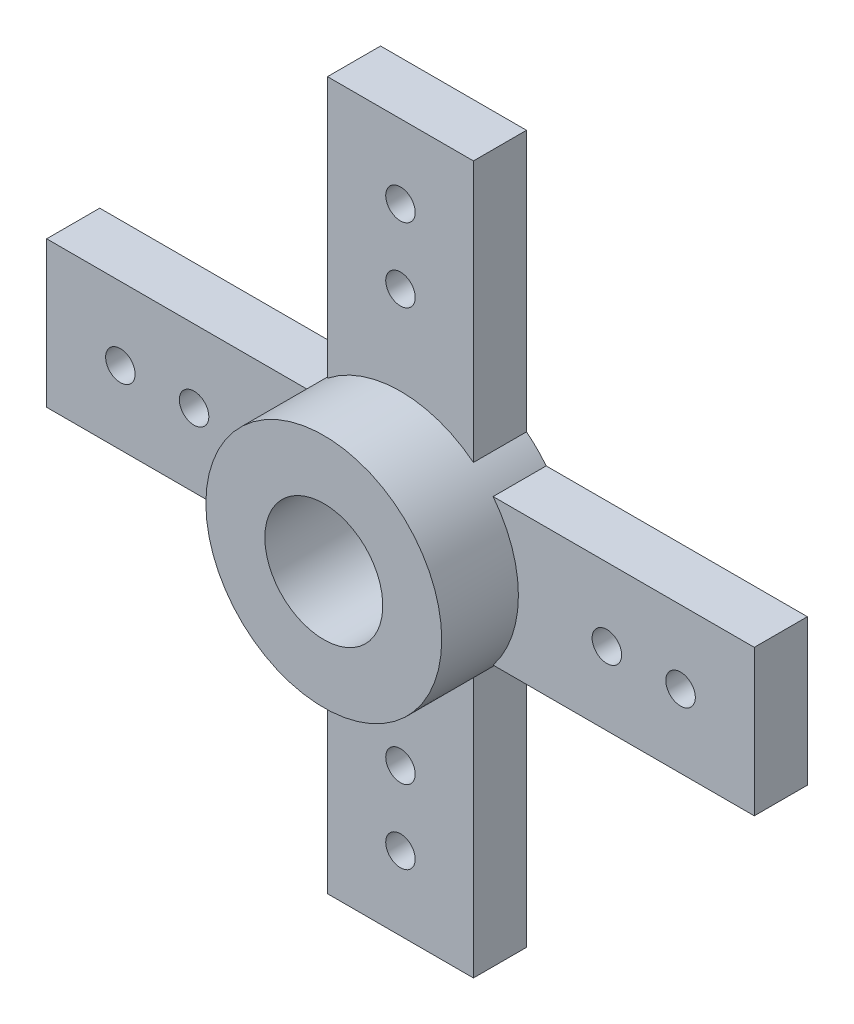
ISO-10303-21;
HEADER;
FILE_DESCRIPTION(('STEP AP214'),'2;1');
FILE_NAME('part.step','',(''),(''),'','','');
FILE_SCHEMA(('AUTOMOTIVE_DESIGN { 1 0 10303 214 1 1 1 1 }'));
ENDSEC;
DATA;
#1=APPLICATION_CONTEXT('core data for automotive mechanical design processes');
#2=APPLICATION_PROTOCOL_DEFINITION('international standard','automotive_design',2000,#1);
#3=PRODUCT_CONTEXT('',#1,'mechanical');
#4=PRODUCT('Part','Part','',(#3));
#5=PRODUCT_RELATED_PRODUCT_CATEGORY('part','',(#4));
#6=PRODUCT_DEFINITION_FORMATION('','',#4);
#7=PRODUCT_DEFINITION_CONTEXT('part definition',#1,'design');
#8=PRODUCT_DEFINITION('design','',#6,#7);
#9=PRODUCT_DEFINITION_SHAPE('','',#8);
#10=(LENGTH_UNIT() NAMED_UNIT(*) SI_UNIT(.MILLI.,.METRE.));
#11=(NAMED_UNIT(*) PLANE_ANGLE_UNIT() SI_UNIT($,.RADIAN.));
#12=(NAMED_UNIT(*) SI_UNIT($,.STERADIAN.) SOLID_ANGLE_UNIT());
#13=UNCERTAINTY_MEASURE_WITH_UNIT(LENGTH_MEASURE(1.E-05),#10,'distance_accuracy_value','');
#14=(GEOMETRIC_REPRESENTATION_CONTEXT(3) GLOBAL_UNCERTAINTY_ASSIGNED_CONTEXT((#13)) GLOBAL_UNIT_ASSIGNED_CONTEXT((#10,
#11,#12)) REPRESENTATION_CONTEXT('',''));
#15=CARTESIAN_POINT('',(0.,0.,0.));
#16=DIRECTION('',(0.,0.,1.));
#17=DIRECTION('',(1.,0.,0.));
#18=AXIS2_PLACEMENT_3D('',#15,#16,#17);
#19=CARTESIAN_POINT('',(0.,0.,1.8));
#20=DIRECTION('',(0.,0.,-1.));
#21=DIRECTION('',(-1.,0.,0.));
#22=AXIS2_PLACEMENT_3D('',#19,#20,#21);
#23=PLANE('',#22);
#24=CARTESIAN_POINT('',(0.,7.,1.8));
#25=DIRECTION('',(0.,0.,1.));
#26=DIRECTION('',(1.,0.,0.));
#27=AXIS2_PLACEMENT_3D('',#24,#25,#26);
#28=CIRCLE('',#27,0.5);
#29=CARTESIAN_POINT('',(0.499999999999999,7.,1.8));
#30=VERTEX_POINT('',#29);
#31=EDGE_CURVE('E317',#30,#30,#28,.T.);
#32=ORIENTED_EDGE('',*,*,#31,.F.);
#33=EDGE_LOOP('',(#32));
#34=FACE_BOUND('',#33,.T.);
#35=CARTESIAN_POINT('',(0.,9.5,1.8));
#36=DIRECTION('',(0.,0.,1.));
#37=DIRECTION('',(1.,0.,0.));
#38=AXIS2_PLACEMENT_3D('',#35,#36,#37);
#39=CIRCLE('',#38,0.5);
#40=CARTESIAN_POINT('',(0.5,9.5,1.8));
#41=VERTEX_POINT('',#40);
#42=EDGE_CURVE('E154',#41,#41,#39,.T.);
#43=ORIENTED_EDGE('',*,*,#42,.F.);
#44=EDGE_LOOP('',(#43));
#45=FACE_BOUND('',#44,.T.);
#46=DIRECTION('',(0.,-1.,0.));
#47=VECTOR('',#46,1.);
#48=CARTESIAN_POINT('',(-2.475,2.47499999999999,1.8));
#49=LINE('',#48,#47);
#50=CARTESIAN_POINT('',(-2.475,12.,1.8));
#51=VERTEX_POINT('',#50);
#52=CARTESIAN_POINT('',(-2.475,3.14235182626007,1.8));
#53=VERTEX_POINT('',#52);
#54=EDGE_CURVE('E120',#51,#53,#49,.T.);
#55=ORIENTED_EDGE('',*,*,#54,.T.);
#56=CARTESIAN_POINT('',(0.,0.,1.8));
#57=DIRECTION('',(0.,0.,-1.));
#58=DIRECTION('',(-1.,0.,0.));
#59=AXIS2_PLACEMENT_3D('',#56,#57,#58);
#60=CIRCLE('',#59,4.);
#61=CARTESIAN_POINT('',(2.475,3.14235182626007,1.8));
#62=VERTEX_POINT('',#61);
#63=EDGE_CURVE('E267',#53,#62,#60,.T.);
#64=ORIENTED_EDGE('',*,*,#63,.T.);
#65=DIRECTION('',(0.,1.,0.));
#66=VECTOR('',#65,1.);
#67=CARTESIAN_POINT('',(2.475,2.47500000000001,1.8));
#68=LINE('',#67,#66);
#69=CARTESIAN_POINT('',(2.475,12.,1.8));
#70=VERTEX_POINT('',#69);
#71=EDGE_CURVE('E122',#62,#70,#68,.T.);
#72=ORIENTED_EDGE('',*,*,#71,.T.);
#73=DIRECTION('',(-1.,0.,0.));
#74=VECTOR('',#73,1.);
#75=CARTESIAN_POINT('',(-2.475,12.,1.8));
#76=LINE('',#75,#74);
#77=EDGE_CURVE('E115',#70,#51,#76,.T.);
#78=ORIENTED_EDGE('',*,*,#77,.T.);
#79=EDGE_LOOP('',(#55,#64,#72,#78));
#80=FACE_BOUND('',#79,.T.);
#81=ADVANCED_FACE('F32',(#34,#45,#80),#23,.F.);
#82=CARTESIAN_POINT('',(9.49999999999999,0.,1.8));
#83=DIRECTION('',(0.,0.,1.));
#84=DIRECTION('',(-1.,0.,0.));
#85=AXIS2_PLACEMENT_3D('',#82,#83,#84);
#86=CIRCLE('',#85,0.499999999999998);
#87=CARTESIAN_POINT('',(8.99999999999999,0.,1.8));
#88=VERTEX_POINT('',#87);
#89=EDGE_CURVE('E287',#88,#88,#86,.T.);
#90=ORIENTED_EDGE('',*,*,#89,.F.);
#91=EDGE_LOOP('',(#90));
#92=FACE_BOUND('',#91,.T.);
#93=CARTESIAN_POINT('',(6.99999999999999,0.,1.8));
#94=DIRECTION('',(0.,0.,1.));
#95=DIRECTION('',(-1.,0.,0.));
#96=AXIS2_PLACEMENT_3D('',#93,#94,#95);
#97=CIRCLE('',#96,0.500000000000001);
#98=CARTESIAN_POINT('',(6.49999999999999,0.,1.8));
#99=VERTEX_POINT('',#98);
#100=EDGE_CURVE('E281',#99,#99,#97,.T.);
#101=ORIENTED_EDGE('',*,*,#100,.F.);
#102=EDGE_LOOP('',(#101));
#103=FACE_BOUND('',#102,.T.);
#104=DIRECTION('',(-1.,0.,0.));
#105=VECTOR('',#104,1.);
#106=CARTESIAN_POINT('',(2.475,2.47500000000001,1.8));
#107=LINE('',#106,#105);
#108=CARTESIAN_POINT('',(12.,2.47500000000004,1.8));
#109=VERTEX_POINT('',#108);
#110=CARTESIAN_POINT('',(3.14235182626006,2.47500000000001,1.8));
#111=VERTEX_POINT('',#110);
#112=EDGE_CURVE('E334',#109,#111,#107,.T.);
#113=ORIENTED_EDGE('',*,*,#112,.T.);
#114=CARTESIAN_POINT('',(3.14235182626008,-2.47499999999999,1.8));
#115=VERTEX_POINT('',#114);
#116=EDGE_CURVE('E260',#111,#115,#60,.T.);
#117=ORIENTED_EDGE('',*,*,#116,.T.);
#118=DIRECTION('',(1.,0.,0.));
#119=VECTOR('',#118,1.);
#120=CARTESIAN_POINT('',(2.475,-2.47499999999999,1.8));
#121=LINE('',#120,#119);
#122=CARTESIAN_POINT('',(12.,-2.47499999999996,1.8));
#123=VERTEX_POINT('',#122);
#124=EDGE_CURVE('E330',#115,#123,#121,.T.);
#125=ORIENTED_EDGE('',*,*,#124,.T.);
#126=DIRECTION('',(0.,1.,0.));
#127=VECTOR('',#126,1.);
#128=CARTESIAN_POINT('',(12.,-2.47499999999996,1.8));
#129=LINE('',#128,#127);
#130=EDGE_CURVE('E332',#123,#109,#129,.T.);
#131=ORIENTED_EDGE('',*,*,#130,.T.);
#132=EDGE_LOOP('',(#113,#117,#125,#131));
#133=FACE_BOUND('',#132,.T.);
#134=ADVANCED_FACE('F338',(#92,#103,#133),#23,.F.);
#135=CARTESIAN_POINT('',(0.,-7.,1.8));
#136=DIRECTION('',(0.,0.,1.));
#137=DIRECTION('',(-1.,0.,0.));
#138=AXIS2_PLACEMENT_3D('',#135,#136,#137);
#139=CIRCLE('',#138,0.5);
#140=CARTESIAN_POINT('',(-0.500000000000001,-7.,1.8));
#141=VERTEX_POINT('',#140);
#142=EDGE_CURVE('E305',#141,#141,#139,.T.);
#143=ORIENTED_EDGE('',*,*,#142,.F.);
#144=EDGE_LOOP('',(#143));
#145=FACE_BOUND('',#144,.T.);
#146=CARTESIAN_POINT('',(0.,-9.5,1.8));
#147=DIRECTION('',(0.,0.,1.));
#148=DIRECTION('',(-1.,0.,0.));
#149=AXIS2_PLACEMENT_3D('',#146,#147,#148);
#150=CIRCLE('',#149,0.5);
#151=CARTESIAN_POINT('',(-0.5,-9.5,1.8));
#152=VERTEX_POINT('',#151);
#153=EDGE_CURVE('E311',#152,#152,#150,.T.);
#154=ORIENTED_EDGE('',*,*,#153,.F.);
#155=EDGE_LOOP('',(#154));
#156=FACE_BOUND('',#155,.T.);
#157=DIRECTION('',(0.,1.,0.));
#158=VECTOR('',#157,1.);
#159=CARTESIAN_POINT('',(2.475,-12.,1.8));
#160=LINE('',#159,#158);
#161=CARTESIAN_POINT('',(2.475,-12.,1.8));
#162=VERTEX_POINT('',#161);
#163=CARTESIAN_POINT('',(2.475,-3.14235182626007,1.8));
#164=VERTEX_POINT('',#163);
#165=EDGE_CURVE('E258',#162,#164,#160,.T.);
#166=ORIENTED_EDGE('',*,*,#165,.T.);
#167=CARTESIAN_POINT('',(-2.475,-3.14235182626007,1.8));
#168=VERTEX_POINT('',#167);
#169=EDGE_CURVE('E252',#164,#168,#60,.T.);
#170=ORIENTED_EDGE('',*,*,#169,.T.);
#171=DIRECTION('',(0.,-1.,0.));
#172=VECTOR('',#171,1.);
#173=CARTESIAN_POINT('',(-2.475,-12.,1.8));
#174=LINE('',#173,#172);
#175=CARTESIAN_POINT('',(-2.475,-12.,1.8));
#176=VERTEX_POINT('',#175);
#177=EDGE_CURVE('E97',#168,#176,#174,.T.);
#178=ORIENTED_EDGE('',*,*,#177,.T.);
#179=DIRECTION('',(1.,0.,0.));
#180=VECTOR('',#179,1.);
#181=CARTESIAN_POINT('',(-2.475,-12.,1.8));
#182=LINE('',#181,#180);
#183=EDGE_CURVE('E194',#176,#162,#182,.T.);
#184=ORIENTED_EDGE('',*,*,#183,.T.);
#185=EDGE_LOOP('',(#166,#170,#178,#184));
#186=FACE_BOUND('',#185,.T.);
#187=ADVANCED_FACE('F257',(#145,#156,#186),#23,.F.);
#188=CARTESIAN_POINT('',(-9.5,0.,1.8));
#189=DIRECTION('',(0.,0.,1.));
#190=DIRECTION('',(1.,0.,0.));
#191=AXIS2_PLACEMENT_3D('',#188,#189,#190);
#192=CIRCLE('',#191,0.500000000000001);
#193=CARTESIAN_POINT('',(-9.,0.,1.8));
#194=VERTEX_POINT('',#193);
#195=EDGE_CURVE('E299',#194,#194,#192,.T.);
#196=ORIENTED_EDGE('',*,*,#195,.F.);
#197=EDGE_LOOP('',(#196));
#198=FACE_BOUND('',#197,.T.);
#199=DIRECTION('',(1.,0.,0.));
#200=VECTOR('',#199,1.);
#201=CARTESIAN_POINT('',(-12.,-2.47500000000004,1.8));
#202=LINE('',#201,#200);
#203=CARTESIAN_POINT('',(-12.,-2.47500000000004,1.8));
#204=VERTEX_POINT('',#203);
#205=CARTESIAN_POINT('',(-3.14235182626006,-2.47500000000001,1.8));
#206=VERTEX_POINT('',#205);
#207=EDGE_CURVE('E148',#204,#206,#202,.T.);
#208=ORIENTED_EDGE('',*,*,#207,.T.);
#209=CARTESIAN_POINT('',(-3.14235182626008,2.47499999999999,1.8));
#210=VERTEX_POINT('',#209);
#211=EDGE_CURVE('E47',#206,#210,#60,.T.);
#212=ORIENTED_EDGE('',*,*,#211,.T.);
#213=DIRECTION('',(-1.,0.,0.));
#214=VECTOR('',#213,1.);
#215=CARTESIAN_POINT('',(-12.,2.47499999999995,1.8));
#216=LINE('',#215,#214);
#217=CARTESIAN_POINT('',(-12.,2.47499999999995,1.8));
#218=VERTEX_POINT('',#217);
#219=EDGE_CURVE('E142',#210,#218,#216,.T.);
#220=ORIENTED_EDGE('',*,*,#219,.T.);
#221=DIRECTION('',(0.,-1.,0.));
#222=VECTOR('',#221,1.);
#223=CARTESIAN_POINT('',(-12.,-2.47500000000004,1.8));
#224=LINE('',#223,#222);
#225=EDGE_CURVE('E55',#218,#204,#224,.T.);
#226=ORIENTED_EDGE('',*,*,#225,.T.);
#227=EDGE_LOOP('',(#208,#212,#220,#226));
#228=FACE_BOUND('',#227,.T.);
#229=CARTESIAN_POINT('',(-7.,0.,1.8));
#230=DIRECTION('',(0.,0.,1.));
#231=DIRECTION('',(1.,0.,0.));
#232=AXIS2_PLACEMENT_3D('',#229,#230,#231);
#233=CIRCLE('',#232,0.5);
#234=CARTESIAN_POINT('',(-6.5,0.,1.8));
#235=VERTEX_POINT('',#234);
#236=EDGE_CURVE('E293',#235,#235,#233,.T.);
#237=ORIENTED_EDGE('',*,*,#236,.F.);
#238=EDGE_LOOP('',(#237));
#239=FACE_BOUND('',#238,.T.);
#240=ADVANCED_FACE('F370',(#198,#228,#239),#23,.F.);
#241=CARTESIAN_POINT('',(0.,0.,0.));
#242=DIRECTION('',(0.,0.,-1.));
#243=DIRECTION('',(-1.,0.,0.));
#244=AXIS2_PLACEMENT_3D('',#241,#242,#243);
#245=PLANE('',#244);
#246=CARTESIAN_POINT('',(0.,0.,0.));
#247=DIRECTION('',(0.,0.,-1.));
#248=DIRECTION('',(-1.,0.,0.));
#249=AXIS2_PLACEMENT_3D('',#246,#247,#248);
#250=CIRCLE('',#249,2.);
#251=CARTESIAN_POINT('',(-2.,0.,0.));
#252=VERTEX_POINT('',#251);
#253=EDGE_CURVE('E354',#252,#252,#250,.T.);
#254=ORIENTED_EDGE('',*,*,#253,.F.);
#255=EDGE_LOOP('',(#254));
#256=FACE_BOUND('',#255,.T.);
#257=DIRECTION('',(-1.,0.,0.));
#258=VECTOR('',#257,1.);
#259=CARTESIAN_POINT('',(-12.,2.47499999999995,0.));
#260=LINE('',#259,#258);
#261=CARTESIAN_POINT('',(-3.14235182626008,2.47499999999999,0.));
#262=VERTEX_POINT('',#261);
#263=CARTESIAN_POINT('',(-12.,2.47499999999995,0.));
#264=VERTEX_POINT('',#263);
#265=EDGE_CURVE('E171',#262,#264,#260,.T.);
#266=ORIENTED_EDGE('',*,*,#265,.F.);
#267=CARTESIAN_POINT('',(0.,0.,0.));
#268=DIRECTION('',(0.,0.,-1.));
#269=DIRECTION('',(-1.,0.,0.));
#270=AXIS2_PLACEMENT_3D('',#267,#268,#269);
#271=CIRCLE('',#270,4.);
#272=CARTESIAN_POINT('',(-2.475,3.14235182626007,0.));
#273=VERTEX_POINT('',#272);
#274=EDGE_CURVE('E271',#273,#262,#271,.F.);
#275=ORIENTED_EDGE('',*,*,#274,.F.);
#276=DIRECTION('',(0.,-1.,0.));
#277=VECTOR('',#276,1.);
#278=CARTESIAN_POINT('',(-2.475,2.47499999999999,0.));
#279=LINE('',#278,#277);
#280=CARTESIAN_POINT('',(-2.475,12.,0.));
#281=VERTEX_POINT('',#280);
#282=EDGE_CURVE('E169',#281,#273,#279,.T.);
#283=ORIENTED_EDGE('',*,*,#282,.F.);
#284=DIRECTION('',(-1.,0.,0.));
#285=VECTOR('',#284,1.);
#286=CARTESIAN_POINT('',(-2.475,12.,0.));
#287=LINE('',#286,#285);
#288=CARTESIAN_POINT('',(2.475,12.,0.));
#289=VERTEX_POINT('',#288);
#290=EDGE_CURVE('E131',#289,#281,#287,.T.);
#291=ORIENTED_EDGE('',*,*,#290,.F.);
#292=DIRECTION('',(0.,1.,0.));
#293=VECTOR('',#292,1.);
#294=CARTESIAN_POINT('',(2.475,2.47500000000001,0.));
#295=LINE('',#294,#293);
#296=CARTESIAN_POINT('',(2.475,3.14235182626007,0.));
#297=VERTEX_POINT('',#296);
#298=EDGE_CURVE('E166',#297,#289,#295,.T.);
#299=ORIENTED_EDGE('',*,*,#298,.F.);
#300=CARTESIAN_POINT('',(3.14235182626006,2.47500000000001,0.));
#301=VERTEX_POINT('',#300);
#302=EDGE_CURVE('E346',#301,#297,#271,.F.);
#303=ORIENTED_EDGE('',*,*,#302,.F.);
#304=DIRECTION('',(-1.,0.,0.));
#305=VECTOR('',#304,1.);
#306=CARTESIAN_POINT('',(2.475,2.47500000000001,0.));
#307=LINE('',#306,#305);
#308=CARTESIAN_POINT('',(12.,2.47500000000004,0.));
#309=VERTEX_POINT('',#308);
#310=EDGE_CURVE('E163',#309,#301,#307,.T.);
#311=ORIENTED_EDGE('',*,*,#310,.F.);
#312=DIRECTION('',(0.,1.,0.));
#313=VECTOR('',#312,1.);
#314=CARTESIAN_POINT('',(12.,-2.47499999999996,0.));
#315=LINE('',#314,#313);
#316=CARTESIAN_POINT('',(12.,-2.47499999999996,0.));
#317=VERTEX_POINT('',#316);
#318=EDGE_CURVE('E161',#317,#309,#315,.T.);
#319=ORIENTED_EDGE('',*,*,#318,.F.);
#320=DIRECTION('',(1.,0.,0.));
#321=VECTOR('',#320,1.);
#322=CARTESIAN_POINT('',(2.475,-2.47499999999999,0.));
#323=LINE('',#322,#321);
#324=CARTESIAN_POINT('',(3.14235182626008,-2.47499999999999,0.));
#325=VERTEX_POINT('',#324);
#326=EDGE_CURVE('E159',#325,#317,#323,.T.);
#327=ORIENTED_EDGE('',*,*,#326,.F.);
#328=CARTESIAN_POINT('',(2.475,-3.14235182626007,0.));
#329=VERTEX_POINT('',#328);
#330=EDGE_CURVE('E211',#329,#325,#271,.F.);
#331=ORIENTED_EDGE('',*,*,#330,.F.);
#332=DIRECTION('',(0.,1.,0.));
#333=VECTOR('',#332,1.);
#334=CARTESIAN_POINT('',(2.475,-12.,0.));
#335=LINE('',#334,#333);
#336=CARTESIAN_POINT('',(2.475,-12.,0.));
#337=VERTEX_POINT('',#336);
#338=EDGE_CURVE('E156',#337,#329,#335,.T.);
#339=ORIENTED_EDGE('',*,*,#338,.F.);
#340=DIRECTION('',(1.,0.,0.));
#341=VECTOR('',#340,1.);
#342=CARTESIAN_POINT('',(-2.475,-12.,0.));
#343=LINE('',#342,#341);
#344=CARTESIAN_POINT('',(-2.475,-12.,0.));
#345=VERTEX_POINT('',#344);
#346=EDGE_CURVE('E153',#345,#337,#343,.T.);
#347=ORIENTED_EDGE('',*,*,#346,.F.);
#348=DIRECTION('',(0.,-1.,0.));
#349=VECTOR('',#348,1.);
#350=CARTESIAN_POINT('',(-2.475,-12.,0.));
#351=LINE('',#350,#349);
#352=CARTESIAN_POINT('',(-2.475,-3.14235182626007,0.));
#353=VERTEX_POINT('',#352);
#354=EDGE_CURVE('E151',#353,#345,#351,.T.);
#355=ORIENTED_EDGE('',*,*,#354,.F.);
#356=CARTESIAN_POINT('',(-3.14235182626006,-2.47500000000001,0.));
#357=VERTEX_POINT('',#356);
#358=EDGE_CURVE('E254',#357,#353,#271,.F.);
#359=ORIENTED_EDGE('',*,*,#358,.F.);
#360=DIRECTION('',(1.,0.,0.));
#361=VECTOR('',#360,1.);
#362=CARTESIAN_POINT('',(-12.,-2.47500000000004,0.));
#363=LINE('',#362,#361);
#364=CARTESIAN_POINT('',(-12.,-2.47500000000004,0.));
#365=VERTEX_POINT('',#364);
#366=EDGE_CURVE('E174',#365,#357,#363,.T.);
#367=ORIENTED_EDGE('',*,*,#366,.F.);
#368=DIRECTION('',(0.,-1.,0.));
#369=VECTOR('',#368,1.);
#370=CARTESIAN_POINT('',(-12.,-2.47500000000004,0.));
#371=LINE('',#370,#369);
#372=EDGE_CURVE('E88',#264,#365,#371,.T.);
#373=ORIENTED_EDGE('',*,*,#372,.F.);
#374=EDGE_LOOP('',(#266,#275,#283,#291,#299,#303,#311,#319,#327,#331,#339,#347,#355,#359,#367,#373));
#375=FACE_BOUND('',#374,.T.);
#376=CARTESIAN_POINT('',(-9.5,0.,0.));
#377=DIRECTION('',(0.,0.,1.));
#378=DIRECTION('',(1.,0.,0.));
#379=AXIS2_PLACEMENT_3D('',#376,#377,#378);
#380=CIRCLE('',#379,0.500000000000001);
#381=CARTESIAN_POINT('',(-9.,0.,0.));
#382=VERTEX_POINT('',#381);
#383=EDGE_CURVE('E296',#382,#382,#380,.T.);
#384=ORIENTED_EDGE('',*,*,#383,.T.);
#385=EDGE_LOOP('',(#384));
#386=FACE_BOUND('',#385,.T.);
#387=CARTESIAN_POINT('',(-7.,0.,0.));
#388=DIRECTION('',(0.,0.,1.));
#389=DIRECTION('',(1.,0.,0.));
#390=AXIS2_PLACEMENT_3D('',#387,#388,#389);
#391=CIRCLE('',#390,0.5);
#392=CARTESIAN_POINT('',(-6.5,0.,0.));
#393=VERTEX_POINT('',#392);
#394=EDGE_CURVE('E290',#393,#393,#391,.T.);
#395=ORIENTED_EDGE('',*,*,#394,.T.);
#396=EDGE_LOOP('',(#395));
#397=FACE_BOUND('',#396,.T.);
#398=CARTESIAN_POINT('',(0.,-7.,0.));
#399=DIRECTION('',(0.,0.,1.));
#400=DIRECTION('',(-1.,0.,0.));
#401=AXIS2_PLACEMENT_3D('',#398,#399,#400);
#402=CIRCLE('',#401,0.5);
#403=CARTESIAN_POINT('',(-0.500000000000001,-7.,0.));
#404=VERTEX_POINT('',#403);
#405=EDGE_CURVE('E302',#404,#404,#402,.T.);
#406=ORIENTED_EDGE('',*,*,#405,.T.);
#407=EDGE_LOOP('',(#406));
#408=FACE_BOUND('',#407,.T.);
#409=CARTESIAN_POINT('',(0.,-9.5,0.));
#410=DIRECTION('',(0.,0.,1.));
#411=DIRECTION('',(-1.,0.,0.));
#412=AXIS2_PLACEMENT_3D('',#409,#410,#411);
#413=CIRCLE('',#412,0.5);
#414=CARTESIAN_POINT('',(-0.5,-9.5,0.));
#415=VERTEX_POINT('',#414);
#416=EDGE_CURVE('E308',#415,#415,#413,.T.);
#417=ORIENTED_EDGE('',*,*,#416,.T.);
#418=EDGE_LOOP('',(#417));
#419=FACE_BOUND('',#418,.T.);
#420=CARTESIAN_POINT('',(9.49999999999999,0.,0.));
#421=DIRECTION('',(0.,0.,1.));
#422=DIRECTION('',(-1.,0.,0.));
#423=AXIS2_PLACEMENT_3D('',#420,#421,#422);
#424=CIRCLE('',#423,0.499999999999998);
#425=CARTESIAN_POINT('',(8.99999999999999,0.,0.));
#426=VERTEX_POINT('',#425);
#427=EDGE_CURVE('E284',#426,#426,#424,.T.);
#428=ORIENTED_EDGE('',*,*,#427,.T.);
#429=EDGE_LOOP('',(#428));
#430=FACE_BOUND('',#429,.T.);
#431=CARTESIAN_POINT('',(6.99999999999999,0.,0.));
#432=DIRECTION('',(0.,0.,1.));
#433=DIRECTION('',(-1.,0.,0.));
#434=AXIS2_PLACEMENT_3D('',#431,#432,#433);
#435=CIRCLE('',#434,0.500000000000001);
#436=CARTESIAN_POINT('',(6.49999999999999,0.,0.));
#437=VERTEX_POINT('',#436);
#438=EDGE_CURVE('E255',#437,#437,#435,.T.);
#439=ORIENTED_EDGE('',*,*,#438,.T.);
#440=EDGE_LOOP('',(#439));
#441=FACE_BOUND('',#440,.T.);
#442=CARTESIAN_POINT('',(0.,7.,0.));
#443=DIRECTION('',(0.,0.,1.));
#444=DIRECTION('',(1.,0.,0.));
#445=AXIS2_PLACEMENT_3D('',#442,#443,#444);
#446=CIRCLE('',#445,0.5);
#447=CARTESIAN_POINT('',(0.499999999999999,7.,0.));
#448=VERTEX_POINT('',#447);
#449=EDGE_CURVE('E314',#448,#448,#446,.T.);
#450=ORIENTED_EDGE('',*,*,#449,.T.);
#451=EDGE_LOOP('',(#450));
#452=FACE_BOUND('',#451,.T.);
#453=CARTESIAN_POINT('',(0.,9.5,0.));
#454=DIRECTION('',(0.,0.,1.));
#455=DIRECTION('',(1.,0.,0.));
#456=AXIS2_PLACEMENT_3D('',#453,#454,#455);
#457=CIRCLE('',#456,0.5);
#458=CARTESIAN_POINT('',(0.5,9.5,0.));
#459=VERTEX_POINT('',#458);
#460=EDGE_CURVE('E320',#459,#459,#457,.T.);
#461=ORIENTED_EDGE('',*,*,#460,.T.);
#462=EDGE_LOOP('',(#461));
#463=FACE_BOUND('',#462,.T.);
#464=ADVANCED_FACE('F205',(#256,#375,#386,#397,#408,#419,#430,#441,#452,#463),#245,.T.);
#465=CARTESIAN_POINT('',(-2.475,-12.,1.8));
#466=DIRECTION('',(1.,0.,0.));
#467=DIRECTION('',(0.,1.,0.));
#468=AXIS2_PLACEMENT_3D('',#465,#466,#467);
#469=PLANE('',#468);
#470=ORIENTED_EDGE('',*,*,#177,.F.);
#471=DIRECTION('',(0.,0.,1.));
#472=VECTOR('',#471,1.);
#473=CARTESIAN_POINT('',(-2.475,-3.14235182626007,-11.3137084989848));
#474=LINE('',#473,#472);
#475=EDGE_CURVE('E200',#168,#353,#474,.F.);
#476=ORIENTED_EDGE('',*,*,#475,.T.);
#477=ORIENTED_EDGE('',*,*,#354,.T.);
#478=DIRECTION('',(0.,0.,-1.));
#479=VECTOR('',#478,1.);
#480=CARTESIAN_POINT('',(-2.475,-12.,1.8));
#481=LINE('',#480,#479);
#482=EDGE_CURVE('E40',#176,#345,#481,.T.);
#483=ORIENTED_EDGE('',*,*,#482,.F.);
#484=EDGE_LOOP('',(#470,#476,#477,#483));
#485=FACE_BOUND('',#484,.T.);
#486=ADVANCED_FACE('F34',(#485),#469,.F.);
#487=CARTESIAN_POINT('',(-2.475,-12.,1.8));
#488=DIRECTION('',(0.,1.,0.));
#489=DIRECTION('',(0.,0.,1.));
#490=AXIS2_PLACEMENT_3D('',#487,#488,#489);
#491=PLANE('',#490);
#492=ORIENTED_EDGE('',*,*,#346,.T.);
#493=DIRECTION('',(0.,0.,-1.));
#494=VECTOR('',#493,1.);
#495=CARTESIAN_POINT('',(2.475,-12.,1.8));
#496=LINE('',#495,#494);
#497=EDGE_CURVE('E186',#162,#337,#496,.T.);
#498=ORIENTED_EDGE('',*,*,#497,.F.);
#499=ORIENTED_EDGE('',*,*,#183,.F.);
#500=ORIENTED_EDGE('',*,*,#482,.T.);
#501=EDGE_LOOP('',(#492,#498,#499,#500));
#502=FACE_BOUND('',#501,.T.);
#503=ADVANCED_FACE('F191',(#502),#491,.F.);
#504=CARTESIAN_POINT('',(2.475,-12.,1.8));
#505=DIRECTION('',(-1.,0.,0.));
#506=DIRECTION('',(0.,-1.,0.));
#507=AXIS2_PLACEMENT_3D('',#504,#505,#506);
#508=PLANE('',#507);
#509=ORIENTED_EDGE('',*,*,#338,.T.);
#510=DIRECTION('',(0.,0.,1.));
#511=VECTOR('',#510,1.);
#512=CARTESIAN_POINT('',(2.475,-3.14235182626007,-11.3137084989848));
#513=LINE('',#512,#511);
#514=EDGE_CURVE('E218',#329,#164,#513,.T.);
#515=ORIENTED_EDGE('',*,*,#514,.T.);
#516=ORIENTED_EDGE('',*,*,#165,.F.);
#517=ORIENTED_EDGE('',*,*,#497,.T.);
#518=EDGE_LOOP('',(#509,#515,#516,#517));
#519=FACE_BOUND('',#518,.T.);
#520=ADVANCED_FACE('F214',(#519),#508,.F.);
#521=CARTESIAN_POINT('',(2.475,-2.47499999999999,1.8));
#522=DIRECTION('',(0.,1.,0.));
#523=DIRECTION('',(-1.,0.,0.));
#524=AXIS2_PLACEMENT_3D('',#521,#522,#523);
#525=PLANE('',#524);
#526=ORIENTED_EDGE('',*,*,#124,.F.);
#527=DIRECTION('',(0.,0.,1.));
#528=VECTOR('',#527,1.);
#529=CARTESIAN_POINT('',(3.14235182626008,-2.47499999999999,-11.3137084989848));
#530=LINE('',#529,#528);
#531=EDGE_CURVE('E261',#115,#325,#530,.F.);
#532=ORIENTED_EDGE('',*,*,#531,.T.);
#533=ORIENTED_EDGE('',*,*,#326,.T.);
#534=DIRECTION('',(0.,0.,-1.));
#535=VECTOR('',#534,1.);
#536=CARTESIAN_POINT('',(12.,-2.47499999999996,1.8));
#537=LINE('',#536,#535);
#538=EDGE_CURVE('E183',#123,#317,#537,.T.);
#539=ORIENTED_EDGE('',*,*,#538,.F.);
#540=EDGE_LOOP('',(#526,#532,#533,#539));
#541=FACE_BOUND('',#540,.T.);
#542=ADVANCED_FACE('F571',(#541),#525,.F.);
#543=CARTESIAN_POINT('',(12.,-2.47499999999996,1.8));
#544=DIRECTION('',(-1.,0.,0.));
#545=DIRECTION('',(0.,-1.,0.));
#546=AXIS2_PLACEMENT_3D('',#543,#544,#545);
#547=PLANE('',#546);
#548=ORIENTED_EDGE('',*,*,#318,.T.);
#549=DIRECTION('',(0.,0.,-1.));
#550=VECTOR('',#549,1.);
#551=CARTESIAN_POINT('',(12.,2.47500000000004,1.8));
#552=LINE('',#551,#550);
#553=EDGE_CURVE('E180',#109,#309,#552,.T.);
#554=ORIENTED_EDGE('',*,*,#553,.F.);
#555=ORIENTED_EDGE('',*,*,#130,.F.);
#556=ORIENTED_EDGE('',*,*,#538,.T.);
#557=EDGE_LOOP('',(#548,#554,#555,#556));
#558=FACE_BOUND('',#557,.T.);
#559=ADVANCED_FACE('F563',(#558),#547,.F.);
#560=CARTESIAN_POINT('',(2.475,2.47500000000001,1.8));
#561=DIRECTION('',(0.,-1.,0.));
#562=DIRECTION('',(1.,0.,0.));
#563=AXIS2_PLACEMENT_3D('',#560,#561,#562);
#564=PLANE('',#563);
#565=ORIENTED_EDGE('',*,*,#310,.T.);
#566=DIRECTION('',(0.,0.,1.));
#567=VECTOR('',#566,1.);
#568=CARTESIAN_POINT('',(3.14235182626006,2.47500000000001,-11.3137084989848));
#569=LINE('',#568,#567);
#570=EDGE_CURVE('E266',#301,#111,#569,.T.);
#571=ORIENTED_EDGE('',*,*,#570,.T.);
#572=ORIENTED_EDGE('',*,*,#112,.F.);
#573=ORIENTED_EDGE('',*,*,#553,.T.);
#574=EDGE_LOOP('',(#565,#571,#572,#573));
#575=FACE_BOUND('',#574,.T.);
#576=ADVANCED_FACE('F343',(#575),#564,.F.);
#577=CARTESIAN_POINT('',(2.475,2.47500000000001,1.8));
#578=DIRECTION('',(-1.,0.,0.));
#579=DIRECTION('',(0.,-1.,0.));
#580=AXIS2_PLACEMENT_3D('',#577,#578,#579);
#581=PLANE('',#580);
#582=ORIENTED_EDGE('',*,*,#71,.F.);
#583=DIRECTION('',(0.,0.,1.));
#584=VECTOR('',#583,1.);
#585=CARTESIAN_POINT('',(2.475,3.14235182626007,-11.3137084989848));
#586=LINE('',#585,#584);
#587=EDGE_CURVE('E272',#62,#297,#586,.F.);
#588=ORIENTED_EDGE('',*,*,#587,.T.);
#589=ORIENTED_EDGE('',*,*,#298,.T.);
#590=DIRECTION('',(0.,0.,-1.));
#591=VECTOR('',#590,1.);
#592=CARTESIAN_POINT('',(2.475,12.,1.8));
#593=LINE('',#592,#591);
#594=EDGE_CURVE('E135',#70,#289,#593,.T.);
#595=ORIENTED_EDGE('',*,*,#594,.F.);
#596=EDGE_LOOP('',(#582,#588,#589,#595));
#597=FACE_BOUND('',#596,.T.);
#598=ADVANCED_FACE('F547',(#597),#581,.F.);
#599=CARTESIAN_POINT('',(-2.475,12.,1.8));
#600=DIRECTION('',(0.,-1.,0.));
#601=DIRECTION('',(0.,0.,-1.));
#602=AXIS2_PLACEMENT_3D('',#599,#600,#601);
#603=PLANE('',#602);
#604=ORIENTED_EDGE('',*,*,#290,.T.);
#605=DIRECTION('',(0.,0.,-1.));
#606=VECTOR('',#605,1.);
#607=CARTESIAN_POINT('',(-2.475,12.,1.8));
#608=LINE('',#607,#606);
#609=EDGE_CURVE('E128',#51,#281,#608,.T.);
#610=ORIENTED_EDGE('',*,*,#609,.F.);
#611=ORIENTED_EDGE('',*,*,#77,.F.);
#612=ORIENTED_EDGE('',*,*,#594,.T.);
#613=EDGE_LOOP('',(#604,#610,#611,#612));
#614=FACE_BOUND('',#613,.T.);
#615=ADVANCED_FACE('F129',(#614),#603,.F.);
#616=CARTESIAN_POINT('',(-2.475,2.47499999999999,1.8));
#617=DIRECTION('',(1.,0.,0.));
#618=DIRECTION('',(0.,1.,0.));
#619=AXIS2_PLACEMENT_3D('',#616,#617,#618);
#620=PLANE('',#619);
#621=ORIENTED_EDGE('',*,*,#282,.T.);
#622=DIRECTION('',(0.,0.,1.));
#623=VECTOR('',#622,1.);
#624=CARTESIAN_POINT('',(-2.475,3.14235182626007,-11.3137084989848));
#625=LINE('',#624,#623);
#626=EDGE_CURVE('E141',#273,#53,#625,.T.);
#627=ORIENTED_EDGE('',*,*,#626,.T.);
#628=ORIENTED_EDGE('',*,*,#54,.F.);
#629=ORIENTED_EDGE('',*,*,#609,.T.);
#630=EDGE_LOOP('',(#621,#627,#628,#629));
#631=FACE_BOUND('',#630,.T.);
#632=ADVANCED_FACE('F139',(#631),#620,.F.);
#633=CARTESIAN_POINT('',(-12.,2.47499999999995,1.8));
#634=DIRECTION('',(0.,-1.,0.));
#635=DIRECTION('',(1.,0.,0.));
#636=AXIS2_PLACEMENT_3D('',#633,#634,#635);
#637=PLANE('',#636);
#638=ORIENTED_EDGE('',*,*,#219,.F.);
#639=DIRECTION('',(0.,0.,1.));
#640=VECTOR('',#639,1.);
#641=CARTESIAN_POINT('',(-3.14235182626008,2.47499999999999,-11.3137084989848));
#642=LINE('',#641,#640);
#643=EDGE_CURVE('E268',#210,#262,#642,.F.);
#644=ORIENTED_EDGE('',*,*,#643,.T.);
#645=ORIENTED_EDGE('',*,*,#265,.T.);
#646=DIRECTION('',(0.,0.,-1.));
#647=VECTOR('',#646,1.);
#648=CARTESIAN_POINT('',(-12.,2.47499999999995,1.8));
#649=LINE('',#648,#647);
#650=EDGE_CURVE('E136',#218,#264,#649,.T.);
#651=ORIENTED_EDGE('',*,*,#650,.F.);
#652=EDGE_LOOP('',(#638,#644,#645,#651));
#653=FACE_BOUND('',#652,.T.);
#654=ADVANCED_FACE('F524',(#653),#637,.F.);
#655=CARTESIAN_POINT('',(-12.,-2.47500000000004,1.8));
#656=DIRECTION('',(1.,0.,0.));
#657=DIRECTION('',(0.,1.,0.));
#658=AXIS2_PLACEMENT_3D('',#655,#656,#657);
#659=PLANE('',#658);
#660=ORIENTED_EDGE('',*,*,#372,.T.);
#661=DIRECTION('',(0.,0.,-1.));
#662=VECTOR('',#661,1.);
#663=CARTESIAN_POINT('',(-12.,-2.47500000000004,1.8));
#664=LINE('',#663,#662);
#665=EDGE_CURVE('E150',#204,#365,#664,.T.);
#666=ORIENTED_EDGE('',*,*,#665,.F.);
#667=ORIENTED_EDGE('',*,*,#225,.F.);
#668=ORIENTED_EDGE('',*,*,#650,.T.);
#669=EDGE_LOOP('',(#660,#666,#667,#668));
#670=FACE_BOUND('',#669,.T.);
#671=ADVANCED_FACE('F516',(#670),#659,.F.);
#672=CARTESIAN_POINT('',(-12.,-2.47500000000004,1.8));
#673=DIRECTION('',(0.,1.,0.));
#674=DIRECTION('',(-1.,0.,0.));
#675=AXIS2_PLACEMENT_3D('',#672,#673,#674);
#676=PLANE('',#675);
#677=ORIENTED_EDGE('',*,*,#366,.T.);
#678=DIRECTION('',(0.,0.,1.));
#679=VECTOR('',#678,1.);
#680=CARTESIAN_POINT('',(-3.14235182626006,-2.47500000000001,-11.3137084989848));
#681=LINE('',#680,#679);
#682=EDGE_CURVE('E11',#357,#206,#681,.T.);
#683=ORIENTED_EDGE('',*,*,#682,.T.);
#684=ORIENTED_EDGE('',*,*,#207,.F.);
#685=ORIENTED_EDGE('',*,*,#665,.T.);
#686=EDGE_LOOP('',(#677,#683,#684,#685));
#687=FACE_BOUND('',#686,.T.);
#688=ADVANCED_FACE('F392',(#687),#676,.F.);
#689=CARTESIAN_POINT('',(0.,9.5,1.8));
#690=DIRECTION('',(0.,0.,-1.));
#691=DIRECTION('',(-1.,0.,0.));
#692=AXIS2_PLACEMENT_3D('',#689,#690,#691);
#693=CYLINDRICAL_SURFACE('',#692,0.5);
#694=ORIENTED_EDGE('',*,*,#42,.T.);
#695=EDGE_LOOP('',(#694));
#696=FACE_BOUND('',#695,.T.);
#697=ORIENTED_EDGE('',*,*,#460,.F.);
#698=EDGE_LOOP('',(#697));
#699=FACE_BOUND('',#698,.T.);
#700=ADVANCED_FACE('F388',(#696,#699),#693,.F.);
#701=CARTESIAN_POINT('',(0.,7.,1.8));
#702=DIRECTION('',(0.,0.,-1.));
#703=DIRECTION('',(-1.,0.,0.));
#704=AXIS2_PLACEMENT_3D('',#701,#702,#703);
#705=CYLINDRICAL_SURFACE('',#704,0.5);
#706=ORIENTED_EDGE('',*,*,#31,.T.);
#707=EDGE_LOOP('',(#706));
#708=FACE_BOUND('',#707,.T.);
#709=ORIENTED_EDGE('',*,*,#449,.F.);
#710=EDGE_LOOP('',(#709));
#711=FACE_BOUND('',#710,.T.);
#712=ADVANCED_FACE('F391',(#708,#711),#705,.F.);
#713=CARTESIAN_POINT('',(0.,-9.5,1.8));
#714=DIRECTION('',(0.,0.,-1.));
#715=DIRECTION('',(-1.,0.,0.));
#716=AXIS2_PLACEMENT_3D('',#713,#714,#715);
#717=CYLINDRICAL_SURFACE('',#716,0.5);
#718=ORIENTED_EDGE('',*,*,#153,.T.);
#719=EDGE_LOOP('',(#718));
#720=FACE_BOUND('',#719,.T.);
#721=ORIENTED_EDGE('',*,*,#416,.F.);
#722=EDGE_LOOP('',(#721));
#723=FACE_BOUND('',#722,.T.);
#724=ADVANCED_FACE('F396',(#720,#723),#717,.F.);
#725=CARTESIAN_POINT('',(0.,-7.,1.8));
#726=DIRECTION('',(0.,0.,-1.));
#727=DIRECTION('',(-1.,0.,0.));
#728=AXIS2_PLACEMENT_3D('',#725,#726,#727);
#729=CYLINDRICAL_SURFACE('',#728,0.5);
#730=ORIENTED_EDGE('',*,*,#142,.T.);
#731=EDGE_LOOP('',(#730));
#732=FACE_BOUND('',#731,.T.);
#733=ORIENTED_EDGE('',*,*,#405,.F.);
#734=EDGE_LOOP('',(#733));
#735=FACE_BOUND('',#734,.T.);
#736=ADVANCED_FACE('F400',(#732,#735),#729,.F.);
#737=CARTESIAN_POINT('',(-9.5,0.,1.8));
#738=DIRECTION('',(0.,0.,-1.));
#739=DIRECTION('',(-1.,0.,0.));
#740=AXIS2_PLACEMENT_3D('',#737,#738,#739);
#741=CYLINDRICAL_SURFACE('',#740,0.500000000000001);
#742=ORIENTED_EDGE('',*,*,#195,.T.);
#743=EDGE_LOOP('',(#742));
#744=FACE_BOUND('',#743,.T.);
#745=ORIENTED_EDGE('',*,*,#383,.F.);
#746=EDGE_LOOP('',(#745));
#747=FACE_BOUND('',#746,.T.);
#748=ADVANCED_FACE('F404',(#744,#747),#741,.F.);
#749=CARTESIAN_POINT('',(-7.,0.,1.8));
#750=DIRECTION('',(0.,0.,-1.));
#751=DIRECTION('',(-1.,0.,0.));
#752=AXIS2_PLACEMENT_3D('',#749,#750,#751);
#753=CYLINDRICAL_SURFACE('',#752,0.5);
#754=ORIENTED_EDGE('',*,*,#236,.T.);
#755=EDGE_LOOP('',(#754));
#756=FACE_BOUND('',#755,.T.);
#757=ORIENTED_EDGE('',*,*,#394,.F.);
#758=EDGE_LOOP('',(#757));
#759=FACE_BOUND('',#758,.T.);
#760=ADVANCED_FACE('F408',(#756,#759),#753,.F.);
#761=CARTESIAN_POINT('',(9.49999999999999,0.,1.8));
#762=DIRECTION('',(0.,0.,-1.));
#763=DIRECTION('',(-1.,0.,0.));
#764=AXIS2_PLACEMENT_3D('',#761,#762,#763);
#765=CYLINDRICAL_SURFACE('',#764,0.499999999999998);
#766=ORIENTED_EDGE('',*,*,#89,.T.);
#767=EDGE_LOOP('',(#766));
#768=FACE_BOUND('',#767,.T.);
#769=ORIENTED_EDGE('',*,*,#427,.F.);
#770=EDGE_LOOP('',(#769));
#771=FACE_BOUND('',#770,.T.);
#772=ADVANCED_FACE('F412',(#768,#771),#765,.F.);
#773=CARTESIAN_POINT('',(6.99999999999999,0.,1.8));
#774=DIRECTION('',(0.,0.,-1.));
#775=DIRECTION('',(-1.,0.,0.));
#776=AXIS2_PLACEMENT_3D('',#773,#774,#775);
#777=CYLINDRICAL_SURFACE('',#776,0.500000000000001);
#778=ORIENTED_EDGE('',*,*,#100,.T.);
#779=EDGE_LOOP('',(#778));
#780=FACE_BOUND('',#779,.T.);
#781=ORIENTED_EDGE('',*,*,#438,.F.);
#782=EDGE_LOOP('',(#781));
#783=FACE_BOUND('',#782,.T.);
#784=ADVANCED_FACE('F416',(#780,#783),#777,.F.);
#785=CARTESIAN_POINT('',(0.,0.,-11.3137084989848));
#786=DIRECTION('',(0.,0.,1.));
#787=DIRECTION('',(1.,0.,0.));
#788=AXIS2_PLACEMENT_3D('',#785,#786,#787);
#789=CYLINDRICAL_SURFACE('',#788,4.);
#790=CARTESIAN_POINT('',(0.,0.,4.4));
#791=DIRECTION('',(0.,0.,1.));
#792=DIRECTION('',(1.,0.,0.));
#793=AXIS2_PLACEMENT_3D('',#790,#791,#792);
#794=CIRCLE('',#793,4.);
#795=CARTESIAN_POINT('',(4.,0.,4.4));
#796=VERTEX_POINT('',#795);
#797=EDGE_CURVE('E349',#796,#796,#794,.T.);
#798=ORIENTED_EDGE('',*,*,#797,.F.);
#799=EDGE_LOOP('',(#798));
#800=FACE_BOUND('',#799,.T.);
#801=ORIENTED_EDGE('',*,*,#475,.F.);
#802=ORIENTED_EDGE('',*,*,#169,.F.);
#803=ORIENTED_EDGE('',*,*,#514,.F.);
#804=ORIENTED_EDGE('',*,*,#330,.T.);
#805=ORIENTED_EDGE('',*,*,#531,.F.);
#806=ORIENTED_EDGE('',*,*,#116,.F.);
#807=ORIENTED_EDGE('',*,*,#570,.F.);
#808=ORIENTED_EDGE('',*,*,#302,.T.);
#809=ORIENTED_EDGE('',*,*,#587,.F.);
#810=ORIENTED_EDGE('',*,*,#63,.F.);
#811=ORIENTED_EDGE('',*,*,#626,.F.);
#812=ORIENTED_EDGE('',*,*,#274,.T.);
#813=ORIENTED_EDGE('',*,*,#643,.F.);
#814=ORIENTED_EDGE('',*,*,#211,.F.);
#815=ORIENTED_EDGE('',*,*,#682,.F.);
#816=ORIENTED_EDGE('',*,*,#358,.T.);
#817=EDGE_LOOP('',(#801,#802,#803,#804,#805,#806,#807,#808,#809,#810,#811,#812,#813,#814,#815,#816));
#818=FACE_BOUND('',#817,.T.);
#819=ADVANCED_FACE('F253',(#800,#818),#789,.T.);
#820=CARTESIAN_POINT('',(0.,0.,4.4));
#821=DIRECTION('',(0.,0.,1.));
#822=DIRECTION('',(1.,0.,0.));
#823=AXIS2_PLACEMENT_3D('',#820,#821,#822);
#824=PLANE('',#823);
#825=CARTESIAN_POINT('',(0.,0.,4.4));
#826=DIRECTION('',(0.,0.,-1.));
#827=DIRECTION('',(-1.,0.,0.));
#828=AXIS2_PLACEMENT_3D('',#825,#826,#827);
#829=CIRCLE('',#828,2.);
#830=CARTESIAN_POINT('',(-2.,0.,4.4));
#831=VERTEX_POINT('',#830);
#832=EDGE_CURVE('E353',#831,#831,#829,.T.);
#833=ORIENTED_EDGE('',*,*,#832,.T.);
#834=EDGE_LOOP('',(#833));
#835=FACE_BOUND('',#834,.T.);
#836=ORIENTED_EDGE('',*,*,#797,.T.);
#837=EDGE_LOOP('',(#836));
#838=FACE_BOUND('',#837,.T.);
#839=ADVANCED_FACE('F360',(#835,#838),#824,.T.);
#840=CARTESIAN_POINT('',(0.,0.,4.4));
#841=DIRECTION('',(0.,0.,-1.));
#842=DIRECTION('',(-1.,0.,0.));
#843=AXIS2_PLACEMENT_3D('',#840,#841,#842);
#844=CYLINDRICAL_SURFACE('',#843,2.);
#845=ORIENTED_EDGE('',*,*,#832,.F.);
#846=EDGE_LOOP('',(#845));
#847=FACE_BOUND('',#846,.T.);
#848=ORIENTED_EDGE('',*,*,#253,.T.);
#849=EDGE_LOOP('',(#848));
#850=FACE_BOUND('',#849,.T.);
#851=ADVANCED_FACE('F363',(#847,#850),#844,.F.);
#852=CLOSED_SHELL('',(#81,#134,#187,#240,#464,#486,#503,#520,#542,#559,#576,#598,#615,#632,#654,
#671,#688,#700,#712,#724,#736,#748,#760,#772,#784,#819,#839,#851));
#853=MANIFOLD_SOLID_BREP('B2',#852);
#854=ADVANCED_BREP_SHAPE_REPRESENTATION('',(#18,#853),#14);
#855=SHAPE_DEFINITION_REPRESENTATION(#9,#854);
ENDSEC;
END-ISO-10303-21;
